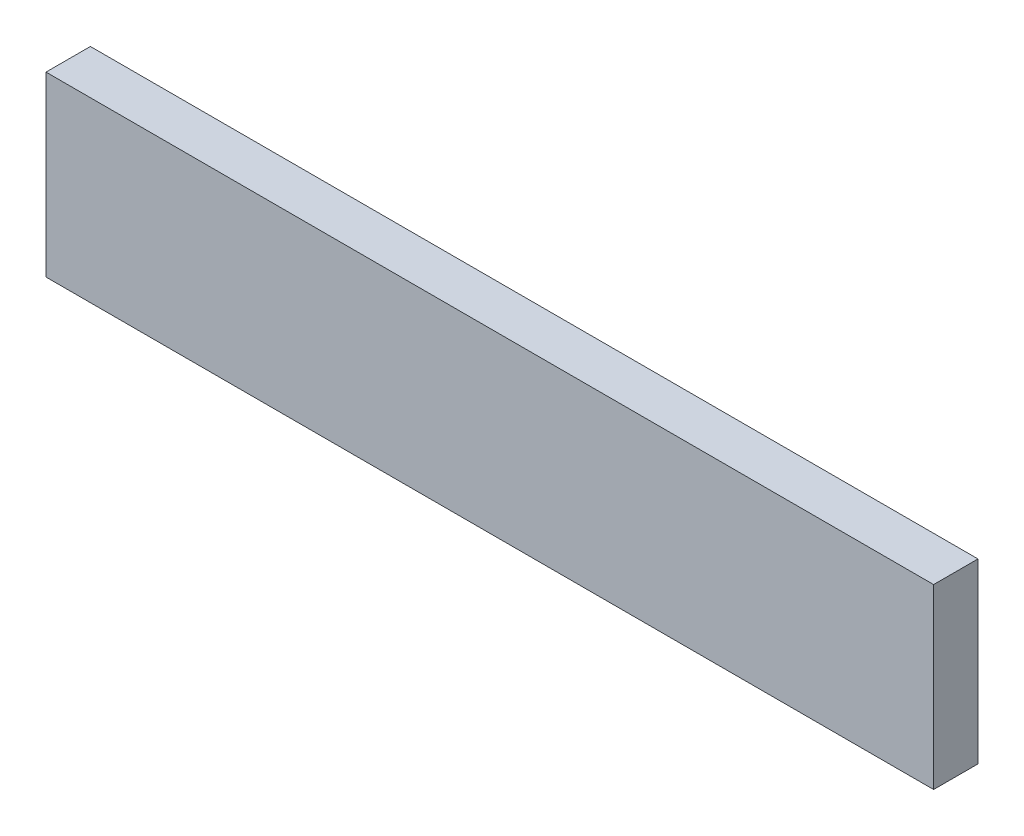
ISO-10303-21;
HEADER;
FILE_DESCRIPTION(('STEP AP214'),'2;1');
FILE_NAME('part.step','',(''),(''),'','','');
FILE_SCHEMA(('AUTOMOTIVE_DESIGN { 1 0 10303 214 1 1 1 1 }'));
ENDSEC;
DATA;
#1=APPLICATION_CONTEXT('core data for automotive mechanical design processes');
#2=APPLICATION_PROTOCOL_DEFINITION('international standard','automotive_design',2000,#1);
#3=PRODUCT_CONTEXT('',#1,'mechanical');
#4=PRODUCT('Part','Part','',(#3));
#5=PRODUCT_RELATED_PRODUCT_CATEGORY('part','',(#4));
#6=PRODUCT_DEFINITION_FORMATION('','',#4);
#7=PRODUCT_DEFINITION_CONTEXT('part definition',#1,'design');
#8=PRODUCT_DEFINITION('design','',#6,#7);
#9=PRODUCT_DEFINITION_SHAPE('','',#8);
#10=(LENGTH_UNIT() NAMED_UNIT(*) SI_UNIT(.MILLI.,.METRE.));
#11=(NAMED_UNIT(*) PLANE_ANGLE_UNIT() SI_UNIT($,.RADIAN.));
#12=(NAMED_UNIT(*) SI_UNIT($,.STERADIAN.) SOLID_ANGLE_UNIT());
#13=UNCERTAINTY_MEASURE_WITH_UNIT(LENGTH_MEASURE(1.E-05),#10,'distance_accuracy_value','');
#14=(GEOMETRIC_REPRESENTATION_CONTEXT(3) GLOBAL_UNCERTAINTY_ASSIGNED_CONTEXT((#13)) GLOBAL_UNIT_ASSIGNED_CONTEXT((#10,
#11,#12)) REPRESENTATION_CONTEXT('',''));
#15=CARTESIAN_POINT('',(0.,0.,0.));
#16=DIRECTION('',(0.,0.,1.));
#17=DIRECTION('',(1.,0.,0.));
#18=AXIS2_PLACEMENT_3D('',#15,#16,#17);
#19=CARTESIAN_POINT('',(0.,-10000.,5000.));
#20=DIRECTION('',(0.,1.,0.));
#21=DIRECTION('',(-1.,0.,0.));
#22=AXIS2_PLACEMENT_3D('',#19,#20,#21);
#23=PLANE('',#22);
#24=DIRECTION('',(1.,0.,0.));
#25=VECTOR('',#24,1.);
#26=CARTESIAN_POINT('',(0.,-10000.,0.));
#27=LINE('',#26,#25);
#28=CARTESIAN_POINT('',(0.,-10000.,0.));
#29=VERTEX_POINT('',#28);
#30=CARTESIAN_POINT('',(100000.,-9999.99999999999,0.));
#31=VERTEX_POINT('',#30);
#32=EDGE_CURVE('E110',#29,#31,#27,.T.);
#33=ORIENTED_EDGE('',*,*,#32,.T.);
#34=DIRECTION('',(0.,0.,-1.));
#35=VECTOR('',#34,1.);
#36=CARTESIAN_POINT('',(100000.,-9999.99999999999,5000.));
#37=LINE('',#36,#35);
#38=CARTESIAN_POINT('',(100000.,-9999.99999999999,5000.));
#39=VERTEX_POINT('',#38);
#40=EDGE_CURVE('E11',#39,#31,#37,.T.);
#41=ORIENTED_EDGE('',*,*,#40,.F.);
#42=DIRECTION('',(1.,0.,0.));
#43=VECTOR('',#42,1.);
#44=CARTESIAN_POINT('',(0.,-10000.,5000.));
#45=LINE('',#44,#43);
#46=CARTESIAN_POINT('',(0.,-10000.,5000.));
#47=VERTEX_POINT('',#46);
#48=EDGE_CURVE('E98',#47,#39,#45,.T.);
#49=ORIENTED_EDGE('',*,*,#48,.F.);
#50=DIRECTION('',(0.,0.,-1.));
#51=VECTOR('',#50,1.);
#52=CARTESIAN_POINT('',(0.,-10000.,5000.));
#53=LINE('',#52,#51);
#54=EDGE_CURVE('E106',#47,#29,#53,.T.);
#55=ORIENTED_EDGE('',*,*,#54,.T.);
#56=EDGE_LOOP('',(#33,#41,#49,#55));
#57=FACE_BOUND('',#56,.T.);
#58=ADVANCED_FACE('F47',(#57),#23,.F.);
#59=CARTESIAN_POINT('',(100000.,-9999.99999999999,5000.));
#60=DIRECTION('',(-1.,0.,0.));
#61=DIRECTION('',(0.,0.,1.));
#62=AXIS2_PLACEMENT_3D('',#59,#60,#61);
#63=PLANE('',#62);
#64=DIRECTION('',(0.,1.,0.));
#65=VECTOR('',#64,1.);
#66=CARTESIAN_POINT('',(100000.,-9999.99999999999,0.));
#67=LINE('',#66,#65);
#68=CARTESIAN_POINT('',(100000.,10000.,0.));
#69=VERTEX_POINT('',#68);
#70=EDGE_CURVE('E102',#31,#69,#67,.T.);
#71=ORIENTED_EDGE('',*,*,#70,.T.);
#72=DIRECTION('',(0.,0.,-1.));
#73=VECTOR('',#72,1.);
#74=CARTESIAN_POINT('',(100000.,10000.,5000.));
#75=LINE('',#74,#73);
#76=CARTESIAN_POINT('',(100000.,10000.,5000.));
#77=VERTEX_POINT('',#76);
#78=EDGE_CURVE('E55',#77,#69,#75,.T.);
#79=ORIENTED_EDGE('',*,*,#78,.F.);
#80=DIRECTION('',(0.,1.,0.));
#81=VECTOR('',#80,1.);
#82=CARTESIAN_POINT('',(100000.,-9999.99999999999,5000.));
#83=LINE('',#82,#81);
#84=EDGE_CURVE('E93',#39,#77,#83,.T.);
#85=ORIENTED_EDGE('',*,*,#84,.F.);
#86=ORIENTED_EDGE('',*,*,#40,.T.);
#87=EDGE_LOOP('',(#71,#79,#85,#86));
#88=FACE_BOUND('',#87,.T.);
#89=ADVANCED_FACE('F101',(#88),#63,.F.);
#90=CARTESIAN_POINT('',(-3.67394039744206E-12,10000.,5000.));
#91=DIRECTION('',(0.,-1.,0.));
#92=DIRECTION('',(1.,0.,0.));
#93=AXIS2_PLACEMENT_3D('',#90,#91,#92);
#94=PLANE('',#93);
#95=DIRECTION('',(-1.,0.,0.));
#96=VECTOR('',#95,1.);
#97=CARTESIAN_POINT('',(-3.67394039744206E-12,10000.,0.));
#98=LINE('',#97,#96);
#99=CARTESIAN_POINT('',(-3.67394039744206E-12,10000.,0.));
#100=VERTEX_POINT('',#99);
#101=EDGE_CURVE('E80',#69,#100,#98,.T.);
#102=ORIENTED_EDGE('',*,*,#101,.T.);
#103=DIRECTION('',(0.,0.,-1.));
#104=VECTOR('',#103,1.);
#105=CARTESIAN_POINT('',(-3.67394039744206E-12,10000.,5000.));
#106=LINE('',#105,#104);
#107=CARTESIAN_POINT('',(-3.67394039744206E-12,10000.,5000.));
#108=VERTEX_POINT('',#107);
#109=EDGE_CURVE('E103',#108,#100,#106,.T.);
#110=ORIENTED_EDGE('',*,*,#109,.F.);
#111=DIRECTION('',(-1.,0.,0.));
#112=VECTOR('',#111,1.);
#113=CARTESIAN_POINT('',(-3.67394039744206E-12,10000.,5000.));
#114=LINE('',#113,#112);
#115=EDGE_CURVE('E96',#77,#108,#114,.T.);
#116=ORIENTED_EDGE('',*,*,#115,.F.);
#117=ORIENTED_EDGE('',*,*,#78,.T.);
#118=EDGE_LOOP('',(#102,#110,#116,#117));
#119=FACE_BOUND('',#118,.T.);
#120=ADVANCED_FACE('F104',(#119),#94,.F.);
#121=CARTESIAN_POINT('',(0.,-10000.,5000.));
#122=DIRECTION('',(1.,0.,0.));
#123=DIRECTION('',(0.,1.,0.));
#124=AXIS2_PLACEMENT_3D('',#121,#122,#123);
#125=PLANE('',#124);
#126=DIRECTION('',(0.,-1.,0.));
#127=VECTOR('',#126,1.);
#128=CARTESIAN_POINT('',(0.,-10000.,0.));
#129=LINE('',#128,#127);
#130=EDGE_CURVE('E86',#100,#29,#129,.T.);
#131=ORIENTED_EDGE('',*,*,#130,.T.);
#132=ORIENTED_EDGE('',*,*,#54,.F.);
#133=DIRECTION('',(0.,-1.,0.));
#134=VECTOR('',#133,1.);
#135=CARTESIAN_POINT('',(0.,-10000.,5000.));
#136=LINE('',#135,#134);
#137=EDGE_CURVE('E63',#108,#47,#136,.T.);
#138=ORIENTED_EDGE('',*,*,#137,.F.);
#139=ORIENTED_EDGE('',*,*,#109,.T.);
#140=EDGE_LOOP('',(#131,#132,#138,#139));
#141=FACE_BOUND('',#140,.T.);
#142=ADVANCED_FACE('F117',(#141),#125,.F.);
#143=CARTESIAN_POINT('',(0.,0.,5000.));
#144=DIRECTION('',(0.,0.,1.));
#145=DIRECTION('',(1.,0.,0.));
#146=AXIS2_PLACEMENT_3D('',#143,#144,#145);
#147=PLANE('',#146);
#148=ORIENTED_EDGE('',*,*,#48,.T.);
#149=ORIENTED_EDGE('',*,*,#84,.T.);
#150=ORIENTED_EDGE('',*,*,#115,.T.);
#151=ORIENTED_EDGE('',*,*,#137,.T.);
#152=EDGE_LOOP('',(#148,#149,#150,#151));
#153=FACE_BOUND('',#152,.T.);
#154=ADVANCED_FACE('F94',(#153),#147,.T.);
#155=CARTESIAN_POINT('',(0.,0.,0.));
#156=DIRECTION('',(0.,0.,1.));
#157=DIRECTION('',(1.,0.,0.));
#158=AXIS2_PLACEMENT_3D('',#155,#156,#157);
#159=PLANE('',#158);
#160=ORIENTED_EDGE('',*,*,#32,.F.);
#161=ORIENTED_EDGE('',*,*,#130,.F.);
#162=ORIENTED_EDGE('',*,*,#101,.F.);
#163=ORIENTED_EDGE('',*,*,#70,.F.);
#164=EDGE_LOOP('',(#160,#161,#162,#163));
#165=FACE_BOUND('',#164,.T.);
#166=ADVANCED_FACE('F120',(#165),#159,.F.);
#167=CLOSED_SHELL('',(#58,#89,#120,#142,#154,#166));
#168=MANIFOLD_SOLID_BREP('B2',#167);
#169=ADVANCED_BREP_SHAPE_REPRESENTATION('',(#18,#168),#14);
#170=SHAPE_DEFINITION_REPRESENTATION(#9,#169);
ENDSEC;
END-ISO-10303-21;
